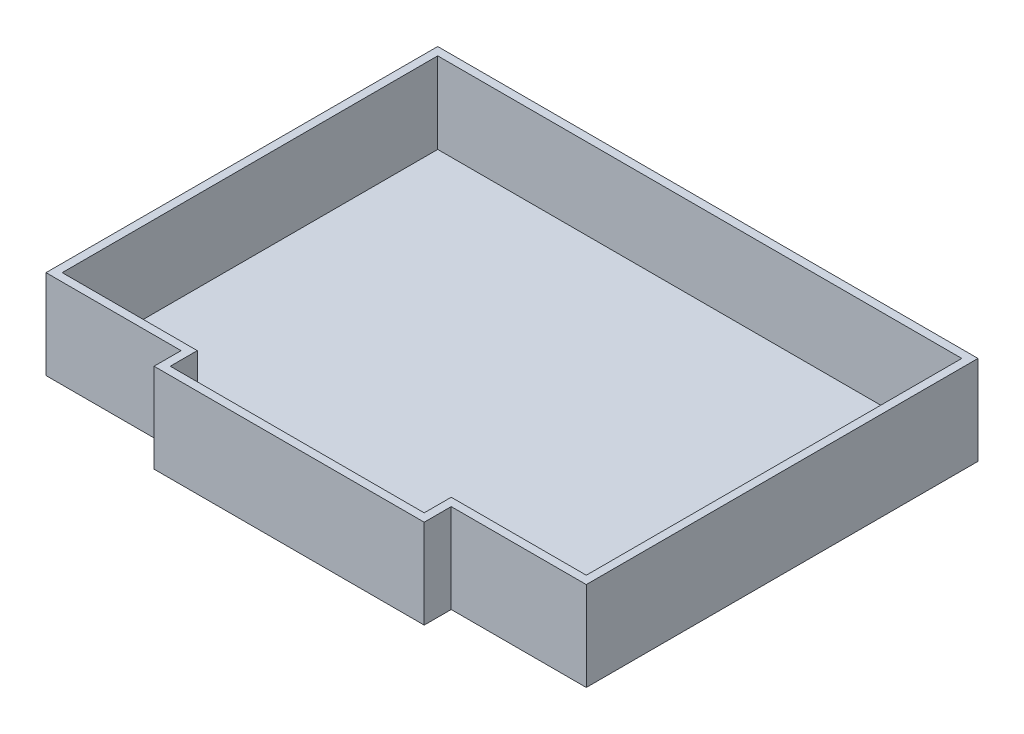
ISO-10303-21;
HEADER;
FILE_DESCRIPTION(('STEP AP214'),'2;1');
FILE_NAME('part.step','',(''),(''),'','','');
FILE_SCHEMA(('AUTOMOTIVE_DESIGN { 1 0 10303 214 1 1 1 1 }'));
ENDSEC;
DATA;
#1=APPLICATION_CONTEXT('core data for automotive mechanical design processes');
#2=APPLICATION_PROTOCOL_DEFINITION('international standard','automotive_design',2000,#1);
#3=PRODUCT_CONTEXT('',#1,'mechanical');
#4=PRODUCT('Part','Part','',(#3));
#5=PRODUCT_RELATED_PRODUCT_CATEGORY('part','',(#4));
#6=PRODUCT_DEFINITION_FORMATION('','',#4);
#7=PRODUCT_DEFINITION_CONTEXT('part definition',#1,'design');
#8=PRODUCT_DEFINITION('design','',#6,#7);
#9=PRODUCT_DEFINITION_SHAPE('','',#8);
#10=(LENGTH_UNIT() NAMED_UNIT(*) SI_UNIT(.MILLI.,.METRE.));
#11=(NAMED_UNIT(*) PLANE_ANGLE_UNIT() SI_UNIT($,.RADIAN.));
#12=(NAMED_UNIT(*) SI_UNIT($,.STERADIAN.) SOLID_ANGLE_UNIT());
#13=UNCERTAINTY_MEASURE_WITH_UNIT(LENGTH_MEASURE(1.E-05),#10,'distance_accuracy_value','');
#14=(GEOMETRIC_REPRESENTATION_CONTEXT(3) GLOBAL_UNCERTAINTY_ASSIGNED_CONTEXT((#13)) GLOBAL_UNIT_ASSIGNED_CONTEXT((#10,
#11,#12)) REPRESENTATION_CONTEXT('',''));
#15=CARTESIAN_POINT('',(0.,0.,0.));
#16=DIRECTION('',(0.,0.,1.));
#17=DIRECTION('',(1.,0.,0.));
#18=AXIS2_PLACEMENT_3D('',#15,#16,#17);
#19=CARTESIAN_POINT('',(200.,3.,-30.));
#20=DIRECTION('',(-1.,0.,0.));
#21=DIRECTION('',(0.,0.,1.));
#22=AXIS2_PLACEMENT_3D('',#19,#20,#21);
#23=PLANE('',#22);
#24=DIRECTION('',(0.,0.,-1.));
#25=VECTOR('',#24,1.);
#26=CARTESIAN_POINT('',(200.,0.,-30.));
#27=LINE('',#26,#25);
#28=CARTESIAN_POINT('',(200.,0.,-30.));
#29=VERTEX_POINT('',#28);
#30=CARTESIAN_POINT('',(200.,0.,-175.));
#31=VERTEX_POINT('',#30);
#32=EDGE_CURVE('E280',#29,#31,#27,.T.);
#33=ORIENTED_EDGE('',*,*,#32,.T.);
#34=DIRECTION('',(0.,-1.,0.));
#35=VECTOR('',#34,1.);
#36=CARTESIAN_POINT('',(200.,3.,-175.));
#37=LINE('',#36,#35);
#38=CARTESIAN_POINT('',(200.,33.,-175.));
#39=VERTEX_POINT('',#38);
#40=EDGE_CURVE('E11',#39,#31,#37,.T.);
#41=ORIENTED_EDGE('',*,*,#40,.F.);
#42=DIRECTION('',(0.,0.,-1.));
#43=VECTOR('',#42,1.);
#44=CARTESIAN_POINT('',(200.,33.,-175.));
#45=LINE('',#44,#43);
#46=CARTESIAN_POINT('',(200.,33.,-30.));
#47=VERTEX_POINT('',#46);
#48=EDGE_CURVE('E272',#47,#39,#45,.T.);
#49=ORIENTED_EDGE('',*,*,#48,.F.);
#50=DIRECTION('',(0.,-1.,0.));
#51=VECTOR('',#50,1.);
#52=CARTESIAN_POINT('',(200.,3.,-30.));
#53=LINE('',#52,#51);
#54=EDGE_CURVE('E304',#47,#29,#53,.T.);
#55=ORIENTED_EDGE('',*,*,#54,.T.);
#56=EDGE_LOOP('',(#33,#41,#49,#55));
#57=FACE_BOUND('',#56,.T.);
#58=ADVANCED_FACE('F41',(#57),#23,.F.);
#59=CARTESIAN_POINT('',(0.,3.,-175.));
#60=DIRECTION('',(0.,0.,1.));
#61=DIRECTION('',(1.,0.,0.));
#62=AXIS2_PLACEMENT_3D('',#59,#60,#61);
#63=PLANE('',#62);
#64=DIRECTION('',(-1.,0.,0.));
#65=VECTOR('',#64,1.);
#66=CARTESIAN_POINT('',(0.,0.,-175.));
#67=LINE('',#66,#65);
#68=CARTESIAN_POINT('',(0.,0.,-175.));
#69=VERTEX_POINT('',#68);
#70=EDGE_CURVE('E284',#31,#69,#67,.T.);
#71=ORIENTED_EDGE('',*,*,#70,.T.);
#72=DIRECTION('',(0.,-1.,0.));
#73=VECTOR('',#72,1.);
#74=CARTESIAN_POINT('',(0.,3.,-175.));
#75=LINE('',#74,#73);
#76=CARTESIAN_POINT('',(0.,33.,-175.));
#77=VERTEX_POINT('',#76);
#78=EDGE_CURVE('E49',#77,#69,#75,.T.);
#79=ORIENTED_EDGE('',*,*,#78,.F.);
#80=DIRECTION('',(-1.,0.,0.));
#81=VECTOR('',#80,1.);
#82=CARTESIAN_POINT('',(0.,33.,-175.));
#83=LINE('',#82,#81);
#84=EDGE_CURVE('E276',#39,#77,#83,.T.);
#85=ORIENTED_EDGE('',*,*,#84,.F.);
#86=ORIENTED_EDGE('',*,*,#40,.T.);
#87=EDGE_LOOP('',(#71,#79,#85,#86));
#88=FACE_BOUND('',#87,.T.);
#89=ADVANCED_FACE('F357',(#88),#63,.F.);
#90=CARTESIAN_POINT('',(0.,3.,-30.));
#91=DIRECTION('',(1.,0.,0.));
#92=DIRECTION('',(0.,0.,-1.));
#93=AXIS2_PLACEMENT_3D('',#90,#91,#92);
#94=PLANE('',#93);
#95=DIRECTION('',(0.,0.,1.));
#96=VECTOR('',#95,1.);
#97=CARTESIAN_POINT('',(0.,0.,-30.));
#98=LINE('',#97,#96);
#99=CARTESIAN_POINT('',(0.,0.,-30.));
#100=VERTEX_POINT('',#99);
#101=EDGE_CURVE('E287',#69,#100,#98,.T.);
#102=ORIENTED_EDGE('',*,*,#101,.T.);
#103=DIRECTION('',(0.,-1.,0.));
#104=VECTOR('',#103,1.);
#105=CARTESIAN_POINT('',(0.,3.,-30.));
#106=LINE('',#105,#104);
#107=CARTESIAN_POINT('',(0.,33.,-30.));
#108=VERTEX_POINT('',#107);
#109=EDGE_CURVE('E322',#108,#100,#106,.T.);
#110=ORIENTED_EDGE('',*,*,#109,.F.);
#111=DIRECTION('',(0.,0.,1.));
#112=VECTOR('',#111,1.);
#113=CARTESIAN_POINT('',(0.,33.,-30.));
#114=LINE('',#113,#112);
#115=EDGE_CURVE('E174',#77,#108,#114,.T.);
#116=ORIENTED_EDGE('',*,*,#115,.F.);
#117=ORIENTED_EDGE('',*,*,#78,.T.);
#118=EDGE_LOOP('',(#102,#110,#116,#117));
#119=FACE_BOUND('',#118,.T.);
#120=ADVANCED_FACE('F330',(#119),#94,.F.);
#121=CARTESIAN_POINT('',(0.,3.,-30.));
#122=DIRECTION('',(0.,0.,-1.));
#123=DIRECTION('',(-1.,0.,0.));
#124=AXIS2_PLACEMENT_3D('',#121,#122,#123);
#125=PLANE('',#124);
#126=DIRECTION('',(1.,0.,0.));
#127=VECTOR('',#126,1.);
#128=CARTESIAN_POINT('',(0.,0.,-30.));
#129=LINE('',#128,#127);
#130=CARTESIAN_POINT('',(50.,0.,-30.));
#131=VERTEX_POINT('',#130);
#132=EDGE_CURVE('E290',#100,#131,#129,.T.);
#133=ORIENTED_EDGE('',*,*,#132,.T.);
#134=DIRECTION('',(0.,-1.,0.));
#135=VECTOR('',#134,1.);
#136=CARTESIAN_POINT('',(50.,3.,-30.));
#137=LINE('',#136,#135);
#138=CARTESIAN_POINT('',(50.,33.,-30.));
#139=VERTEX_POINT('',#138);
#140=EDGE_CURVE('E318',#139,#131,#137,.T.);
#141=ORIENTED_EDGE('',*,*,#140,.F.);
#142=DIRECTION('',(1.,0.,0.));
#143=VECTOR('',#142,1.);
#144=CARTESIAN_POINT('',(50.,33.,-30.));
#145=LINE('',#144,#143);
#146=EDGE_CURVE('E252',#108,#139,#145,.T.);
#147=ORIENTED_EDGE('',*,*,#146,.F.);
#148=ORIENTED_EDGE('',*,*,#109,.T.);
#149=EDGE_LOOP('',(#133,#141,#147,#148));
#150=FACE_BOUND('',#149,.T.);
#151=ADVANCED_FACE('F340',(#150),#125,.F.);
#152=CARTESIAN_POINT('',(50.,3.,-20.));
#153=DIRECTION('',(1.,0.,0.));
#154=DIRECTION('',(0.,0.,-1.));
#155=AXIS2_PLACEMENT_3D('',#152,#153,#154);
#156=PLANE('',#155);
#157=DIRECTION('',(0.,0.,1.));
#158=VECTOR('',#157,1.);
#159=CARTESIAN_POINT('',(50.,0.,-20.));
#160=LINE('',#159,#158);
#161=CARTESIAN_POINT('',(50.,0.,-20.));
#162=VERTEX_POINT('',#161);
#163=EDGE_CURVE('E293',#131,#162,#160,.T.);
#164=ORIENTED_EDGE('',*,*,#163,.T.);
#165=DIRECTION('',(0.,-1.,0.));
#166=VECTOR('',#165,1.);
#167=CARTESIAN_POINT('',(50.,3.,-20.));
#168=LINE('',#167,#166);
#169=CARTESIAN_POINT('',(50.,33.,-20.));
#170=VERTEX_POINT('',#169);
#171=EDGE_CURVE('E314',#170,#162,#168,.T.);
#172=ORIENTED_EDGE('',*,*,#171,.F.);
#173=DIRECTION('',(0.,0.,1.));
#174=VECTOR('',#173,1.);
#175=CARTESIAN_POINT('',(50.,33.,-20.));
#176=LINE('',#175,#174);
#177=EDGE_CURVE('E256',#139,#170,#176,.T.);
#178=ORIENTED_EDGE('',*,*,#177,.F.);
#179=ORIENTED_EDGE('',*,*,#140,.T.);
#180=EDGE_LOOP('',(#164,#172,#178,#179));
#181=FACE_BOUND('',#180,.T.);
#182=ADVANCED_FACE('F344',(#181),#156,.F.);
#183=CARTESIAN_POINT('',(50.,3.,-20.));
#184=DIRECTION('',(0.,0.,-1.));
#185=DIRECTION('',(-1.,0.,0.));
#186=AXIS2_PLACEMENT_3D('',#183,#184,#185);
#187=PLANE('',#186);
#188=DIRECTION('',(1.,0.,0.));
#189=VECTOR('',#188,1.);
#190=CARTESIAN_POINT('',(50.,0.,-20.));
#191=LINE('',#190,#189);
#192=CARTESIAN_POINT('',(150.,0.,-20.));
#193=VERTEX_POINT('',#192);
#194=EDGE_CURVE('E296',#162,#193,#191,.T.);
#195=ORIENTED_EDGE('',*,*,#194,.T.);
#196=DIRECTION('',(0.,-1.,0.));
#197=VECTOR('',#196,1.);
#198=CARTESIAN_POINT('',(150.,3.,-20.));
#199=LINE('',#198,#197);
#200=CARTESIAN_POINT('',(150.,33.,-20.));
#201=VERTEX_POINT('',#200);
#202=EDGE_CURVE('E310',#201,#193,#199,.T.);
#203=ORIENTED_EDGE('',*,*,#202,.F.);
#204=DIRECTION('',(1.,0.,0.));
#205=VECTOR('',#204,1.);
#206=CARTESIAN_POINT('',(150.,33.,-20.));
#207=LINE('',#206,#205);
#208=EDGE_CURVE('E260',#170,#201,#207,.T.);
#209=ORIENTED_EDGE('',*,*,#208,.F.);
#210=ORIENTED_EDGE('',*,*,#171,.T.);
#211=EDGE_LOOP('',(#195,#203,#209,#210));
#212=FACE_BOUND('',#211,.T.);
#213=ADVANCED_FACE('F349',(#212),#187,.F.);
#214=CARTESIAN_POINT('',(150.,3.,-20.));
#215=DIRECTION('',(-1.,0.,0.));
#216=DIRECTION('',(0.,0.,1.));
#217=AXIS2_PLACEMENT_3D('',#214,#215,#216);
#218=PLANE('',#217);
#219=DIRECTION('',(0.,0.,-1.));
#220=VECTOR('',#219,1.);
#221=CARTESIAN_POINT('',(150.,0.,-20.));
#222=LINE('',#221,#220);
#223=CARTESIAN_POINT('',(150.,0.,-30.));
#224=VERTEX_POINT('',#223);
#225=EDGE_CURVE('E299',#193,#224,#222,.T.);
#226=ORIENTED_EDGE('',*,*,#225,.T.);
#227=DIRECTION('',(0.,-1.,0.));
#228=VECTOR('',#227,1.);
#229=CARTESIAN_POINT('',(150.,3.,-30.));
#230=LINE('',#229,#228);
#231=CARTESIAN_POINT('',(150.,33.,-30.));
#232=VERTEX_POINT('',#231);
#233=EDGE_CURVE('E307',#232,#224,#230,.T.);
#234=ORIENTED_EDGE('',*,*,#233,.F.);
#235=DIRECTION('',(0.,0.,-1.));
#236=VECTOR('',#235,1.);
#237=CARTESIAN_POINT('',(150.,33.,-30.));
#238=LINE('',#237,#236);
#239=EDGE_CURVE('E264',#201,#232,#238,.T.);
#240=ORIENTED_EDGE('',*,*,#239,.F.);
#241=ORIENTED_EDGE('',*,*,#202,.T.);
#242=EDGE_LOOP('',(#226,#234,#240,#241));
#243=FACE_BOUND('',#242,.T.);
#244=ADVANCED_FACE('F352',(#243),#218,.F.);
#245=CARTESIAN_POINT('',(200.,3.,-30.));
#246=DIRECTION('',(0.,0.,-1.));
#247=DIRECTION('',(-1.,0.,0.));
#248=AXIS2_PLACEMENT_3D('',#245,#246,#247);
#249=PLANE('',#248);
#250=DIRECTION('',(1.,0.,0.));
#251=VECTOR('',#250,1.);
#252=CARTESIAN_POINT('',(200.,0.,-30.));
#253=LINE('',#252,#251);
#254=EDGE_CURVE('E64',#224,#29,#253,.T.);
#255=ORIENTED_EDGE('',*,*,#254,.T.);
#256=ORIENTED_EDGE('',*,*,#54,.F.);
#257=DIRECTION('',(1.,0.,0.));
#258=VECTOR('',#257,1.);
#259=CARTESIAN_POINT('',(200.,33.,-30.));
#260=LINE('',#259,#258);
#261=EDGE_CURVE('E268',#232,#47,#260,.T.);
#262=ORIENTED_EDGE('',*,*,#261,.F.);
#263=ORIENTED_EDGE('',*,*,#233,.T.);
#264=EDGE_LOOP('',(#255,#256,#262,#263));
#265=FACE_BOUND('',#264,.T.);
#266=ADVANCED_FACE('F356',(#265),#249,.F.);
#267=CARTESIAN_POINT('',(0.,0.,0.));
#268=DIRECTION('',(0.,-1.,0.));
#269=DIRECTION('',(0.,0.,-1.));
#270=AXIS2_PLACEMENT_3D('',#267,#268,#269);
#271=PLANE('',#270);
#272=ORIENTED_EDGE('',*,*,#32,.F.);
#273=ORIENTED_EDGE('',*,*,#254,.F.);
#274=ORIENTED_EDGE('',*,*,#225,.F.);
#275=ORIENTED_EDGE('',*,*,#194,.F.);
#276=ORIENTED_EDGE('',*,*,#163,.F.);
#277=ORIENTED_EDGE('',*,*,#132,.F.);
#278=ORIENTED_EDGE('',*,*,#101,.F.);
#279=ORIENTED_EDGE('',*,*,#70,.F.);
#280=EDGE_LOOP('',(#272,#273,#274,#275,#276,#277,#278,#279));
#281=FACE_BOUND('',#280,.T.);
#282=ADVANCED_FACE('F336',(#281),#271,.T.);
#283=CARTESIAN_POINT('',(0.,33.,0.));
#284=DIRECTION('',(0.,-1.,0.));
#285=DIRECTION('',(0.,0.,-1.));
#286=AXIS2_PLACEMENT_3D('',#283,#284,#285);
#287=PLANE('',#286);
#288=ORIENTED_EDGE('',*,*,#115,.T.);
#289=ORIENTED_EDGE('',*,*,#146,.T.);
#290=ORIENTED_EDGE('',*,*,#177,.T.);
#291=ORIENTED_EDGE('',*,*,#208,.T.);
#292=ORIENTED_EDGE('',*,*,#239,.T.);
#293=ORIENTED_EDGE('',*,*,#261,.T.);
#294=ORIENTED_EDGE('',*,*,#48,.T.);
#295=ORIENTED_EDGE('',*,*,#84,.T.);
#296=EDGE_LOOP('',(#288,#289,#290,#291,#292,#293,#294,#295));
#297=FACE_BOUND('',#296,.T.);
#298=DIRECTION('',(1.,0.,0.));
#299=VECTOR('',#298,1.);
#300=CARTESIAN_POINT('',(147.,33.,-33.));
#301=LINE('',#300,#299);
#302=CARTESIAN_POINT('',(147.,33.,-33.));
#303=VERTEX_POINT('',#302);
#304=CARTESIAN_POINT('',(197.,33.,-33.));
#305=VERTEX_POINT('',#304);
#306=EDGE_CURVE('E156',#303,#305,#301,.T.);
#307=ORIENTED_EDGE('',*,*,#306,.F.);
#308=DIRECTION('',(0.,0.,-1.));
#309=VECTOR('',#308,1.);
#310=CARTESIAN_POINT('',(147.,33.,-23.));
#311=LINE('',#310,#309);
#312=CARTESIAN_POINT('',(147.,33.,-23.));
#313=VERTEX_POINT('',#312);
#314=EDGE_CURVE('E199',#313,#303,#311,.T.);
#315=ORIENTED_EDGE('',*,*,#314,.F.);
#316=DIRECTION('',(1.,0.,0.));
#317=VECTOR('',#316,1.);
#318=CARTESIAN_POINT('',(53.,33.,-23.));
#319=LINE('',#318,#317);
#320=CARTESIAN_POINT('',(53.,33.,-23.));
#321=VERTEX_POINT('',#320);
#322=EDGE_CURVE('E195',#321,#313,#319,.T.);
#323=ORIENTED_EDGE('',*,*,#322,.F.);
#324=DIRECTION('',(0.,0.,1.));
#325=VECTOR('',#324,1.);
#326=CARTESIAN_POINT('',(53.,33.,-33.));
#327=LINE('',#326,#325);
#328=CARTESIAN_POINT('',(53.,33.,-33.));
#329=VERTEX_POINT('',#328);
#330=EDGE_CURVE('E192',#329,#321,#327,.T.);
#331=ORIENTED_EDGE('',*,*,#330,.F.);
#332=DIRECTION('',(1.,0.,0.));
#333=VECTOR('',#332,1.);
#334=CARTESIAN_POINT('',(2.99999999999999,33.,-33.));
#335=LINE('',#334,#333);
#336=CARTESIAN_POINT('',(2.99999999999999,33.,-33.));
#337=VERTEX_POINT('',#336);
#338=EDGE_CURVE('E189',#337,#329,#335,.T.);
#339=ORIENTED_EDGE('',*,*,#338,.F.);
#340=DIRECTION('',(0.,0.,1.));
#341=VECTOR('',#340,1.);
#342=CARTESIAN_POINT('',(3.,33.,-172.));
#343=LINE('',#342,#341);
#344=CARTESIAN_POINT('',(3.,33.,-172.));
#345=VERTEX_POINT('',#344);
#346=EDGE_CURVE('E184',#345,#337,#343,.T.);
#347=ORIENTED_EDGE('',*,*,#346,.F.);
#348=DIRECTION('',(-1.,0.,0.));
#349=VECTOR('',#348,1.);
#350=CARTESIAN_POINT('',(197.,33.,-172.));
#351=LINE('',#350,#349);
#352=CARTESIAN_POINT('',(197.,33.,-172.));
#353=VERTEX_POINT('',#352);
#354=EDGE_CURVE('E180',#353,#345,#351,.T.);
#355=ORIENTED_EDGE('',*,*,#354,.F.);
#356=DIRECTION('',(0.,0.,-1.));
#357=VECTOR('',#356,1.);
#358=CARTESIAN_POINT('',(197.,33.,-33.));
#359=LINE('',#358,#357);
#360=EDGE_CURVE('E165',#305,#353,#359,.T.);
#361=ORIENTED_EDGE('',*,*,#360,.F.);
#362=EDGE_LOOP('',(#307,#315,#323,#331,#339,#347,#355,#361));
#363=FACE_BOUND('',#362,.T.);
#364=ADVANCED_FACE('F178',(#297,#363),#287,.F.);
#365=CARTESIAN_POINT('',(147.,33.,-33.));
#366=DIRECTION('',(0.,0.,-1.));
#367=DIRECTION('',(-1.,0.,0.));
#368=AXIS2_PLACEMENT_3D('',#365,#366,#367);
#369=PLANE('',#368);
#370=DIRECTION('',(1.,0.,0.));
#371=VECTOR('',#370,1.);
#372=CARTESIAN_POINT('',(147.,3.,-33.));
#373=LINE('',#372,#371);
#374=CARTESIAN_POINT('',(147.,3.,-33.));
#375=VERTEX_POINT('',#374);
#376=CARTESIAN_POINT('',(197.,3.,-33.));
#377=VERTEX_POINT('',#376);
#378=EDGE_CURVE('E202',#375,#377,#373,.T.);
#379=ORIENTED_EDGE('',*,*,#378,.F.);
#380=DIRECTION('',(0.,-1.,0.));
#381=VECTOR('',#380,1.);
#382=CARTESIAN_POINT('',(147.,33.,-33.));
#383=LINE('',#382,#381);
#384=EDGE_CURVE('E56',#303,#375,#383,.T.);
#385=ORIENTED_EDGE('',*,*,#384,.F.);
#386=ORIENTED_EDGE('',*,*,#306,.T.);
#387=DIRECTION('',(0.,-1.,0.));
#388=VECTOR('',#387,1.);
#389=CARTESIAN_POINT('',(197.,33.,-33.));
#390=LINE('',#389,#388);
#391=EDGE_CURVE('E159',#305,#377,#390,.T.);
#392=ORIENTED_EDGE('',*,*,#391,.T.);
#393=EDGE_LOOP('',(#379,#385,#386,#392));
#394=FACE_BOUND('',#393,.T.);
#395=ADVANCED_FACE('F158',(#394),#369,.T.);
#396=CARTESIAN_POINT('',(197.,33.,-33.));
#397=DIRECTION('',(-1.,0.,0.));
#398=DIRECTION('',(0.,0.,1.));
#399=AXIS2_PLACEMENT_3D('',#396,#397,#398);
#400=PLANE('',#399);
#401=DIRECTION('',(0.,0.,-1.));
#402=VECTOR('',#401,1.);
#403=CARTESIAN_POINT('',(197.,3.,-33.));
#404=LINE('',#403,#402);
#405=CARTESIAN_POINT('',(197.,3.,-172.));
#406=VERTEX_POINT('',#405);
#407=EDGE_CURVE('E172',#377,#406,#404,.T.);
#408=ORIENTED_EDGE('',*,*,#407,.F.);
#409=ORIENTED_EDGE('',*,*,#391,.F.);
#410=ORIENTED_EDGE('',*,*,#360,.T.);
#411=DIRECTION('',(0.,-1.,0.));
#412=VECTOR('',#411,1.);
#413=CARTESIAN_POINT('',(197.,33.,-172.));
#414=LINE('',#413,#412);
#415=EDGE_CURVE('E175',#353,#406,#414,.T.);
#416=ORIENTED_EDGE('',*,*,#415,.T.);
#417=EDGE_LOOP('',(#408,#409,#410,#416));
#418=FACE_BOUND('',#417,.T.);
#419=ADVANCED_FACE('F169',(#418),#400,.T.);
#420=CARTESIAN_POINT('',(197.,33.,-172.));
#421=DIRECTION('',(0.,0.,1.));
#422=DIRECTION('',(1.,0.,0.));
#423=AXIS2_PLACEMENT_3D('',#420,#421,#422);
#424=PLANE('',#423);
#425=DIRECTION('',(-1.,0.,0.));
#426=VECTOR('',#425,1.);
#427=CARTESIAN_POINT('',(197.,3.,-172.));
#428=LINE('',#427,#426);
#429=CARTESIAN_POINT('',(3.,3.,-172.));
#430=VERTEX_POINT('',#429);
#431=EDGE_CURVE('E207',#406,#430,#428,.T.);
#432=ORIENTED_EDGE('',*,*,#431,.F.);
#433=ORIENTED_EDGE('',*,*,#415,.F.);
#434=ORIENTED_EDGE('',*,*,#354,.T.);
#435=DIRECTION('',(0.,-1.,0.));
#436=VECTOR('',#435,1.);
#437=CARTESIAN_POINT('',(3.,33.,-172.));
#438=LINE('',#437,#436);
#439=EDGE_CURVE('E244',#345,#430,#438,.T.);
#440=ORIENTED_EDGE('',*,*,#439,.T.);
#441=EDGE_LOOP('',(#432,#433,#434,#440));
#442=FACE_BOUND('',#441,.T.);
#443=ADVANCED_FACE('F388',(#442),#424,.T.);
#444=CARTESIAN_POINT('',(3.,33.,-172.));
#445=DIRECTION('',(1.,0.,0.));
#446=DIRECTION('',(0.,0.,-1.));
#447=AXIS2_PLACEMENT_3D('',#444,#445,#446);
#448=PLANE('',#447);
#449=DIRECTION('',(0.,0.,1.));
#450=VECTOR('',#449,1.);
#451=CARTESIAN_POINT('',(3.,3.,-172.));
#452=LINE('',#451,#450);
#453=CARTESIAN_POINT('',(2.99999999999999,3.,-33.));
#454=VERTEX_POINT('',#453);
#455=EDGE_CURVE('E211',#430,#454,#452,.T.);
#456=ORIENTED_EDGE('',*,*,#455,.F.);
#457=ORIENTED_EDGE('',*,*,#439,.F.);
#458=ORIENTED_EDGE('',*,*,#346,.T.);
#459=DIRECTION('',(0.,-1.,0.));
#460=VECTOR('',#459,1.);
#461=CARTESIAN_POINT('',(2.99999999999999,33.,-33.));
#462=LINE('',#461,#460);
#463=EDGE_CURVE('E241',#337,#454,#462,.T.);
#464=ORIENTED_EDGE('',*,*,#463,.T.);
#465=EDGE_LOOP('',(#456,#457,#458,#464));
#466=FACE_BOUND('',#465,.T.);
#467=ADVANCED_FACE('F391',(#466),#448,.T.);
#468=CARTESIAN_POINT('',(2.99999999999999,33.,-33.));
#469=DIRECTION('',(0.,0.,-1.));
#470=DIRECTION('',(-1.,0.,0.));
#471=AXIS2_PLACEMENT_3D('',#468,#469,#470);
#472=PLANE('',#471);
#473=DIRECTION('',(1.,0.,0.));
#474=VECTOR('',#473,1.);
#475=CARTESIAN_POINT('',(2.99999999999999,3.,-33.));
#476=LINE('',#475,#474);
#477=CARTESIAN_POINT('',(53.,3.,-33.));
#478=VERTEX_POINT('',#477);
#479=EDGE_CURVE('E215',#454,#478,#476,.T.);
#480=ORIENTED_EDGE('',*,*,#479,.F.);
#481=ORIENTED_EDGE('',*,*,#463,.F.);
#482=ORIENTED_EDGE('',*,*,#338,.T.);
#483=DIRECTION('',(0.,-1.,0.));
#484=VECTOR('',#483,1.);
#485=CARTESIAN_POINT('',(53.,33.,-33.));
#486=LINE('',#485,#484);
#487=EDGE_CURVE('E238',#329,#478,#486,.T.);
#488=ORIENTED_EDGE('',*,*,#487,.T.);
#489=EDGE_LOOP('',(#480,#481,#482,#488));
#490=FACE_BOUND('',#489,.T.);
#491=ADVANCED_FACE('F395',(#490),#472,.T.);
#492=CARTESIAN_POINT('',(53.,33.,-33.));
#493=DIRECTION('',(1.,0.,0.));
#494=DIRECTION('',(0.,0.,-1.));
#495=AXIS2_PLACEMENT_3D('',#492,#493,#494);
#496=PLANE('',#495);
#497=DIRECTION('',(0.,0.,1.));
#498=VECTOR('',#497,1.);
#499=CARTESIAN_POINT('',(53.,3.,-33.));
#500=LINE('',#499,#498);
#501=CARTESIAN_POINT('',(53.,3.,-23.));
#502=VERTEX_POINT('',#501);
#503=EDGE_CURVE('E219',#478,#502,#500,.T.);
#504=ORIENTED_EDGE('',*,*,#503,.F.);
#505=ORIENTED_EDGE('',*,*,#487,.F.);
#506=ORIENTED_EDGE('',*,*,#330,.T.);
#507=DIRECTION('',(0.,-1.,0.));
#508=VECTOR('',#507,1.);
#509=CARTESIAN_POINT('',(53.,33.,-23.));
#510=LINE('',#509,#508);
#511=EDGE_CURVE('E235',#321,#502,#510,.T.);
#512=ORIENTED_EDGE('',*,*,#511,.T.);
#513=EDGE_LOOP('',(#504,#505,#506,#512));
#514=FACE_BOUND('',#513,.T.);
#515=ADVANCED_FACE('F399',(#514),#496,.T.);
#516=CARTESIAN_POINT('',(53.,33.,-23.));
#517=DIRECTION('',(0.,0.,-1.));
#518=DIRECTION('',(-1.,0.,0.));
#519=AXIS2_PLACEMENT_3D('',#516,#517,#518);
#520=PLANE('',#519);
#521=DIRECTION('',(1.,0.,0.));
#522=VECTOR('',#521,1.);
#523=CARTESIAN_POINT('',(53.,3.,-23.));
#524=LINE('',#523,#522);
#525=CARTESIAN_POINT('',(147.,3.,-23.));
#526=VERTEX_POINT('',#525);
#527=EDGE_CURVE('E223',#502,#526,#524,.T.);
#528=ORIENTED_EDGE('',*,*,#527,.F.);
#529=ORIENTED_EDGE('',*,*,#511,.F.);
#530=ORIENTED_EDGE('',*,*,#322,.T.);
#531=DIRECTION('',(0.,-1.,0.));
#532=VECTOR('',#531,1.);
#533=CARTESIAN_POINT('',(147.,33.,-23.));
#534=LINE('',#533,#532);
#535=EDGE_CURVE('E232',#313,#526,#534,.T.);
#536=ORIENTED_EDGE('',*,*,#535,.T.);
#537=EDGE_LOOP('',(#528,#529,#530,#536));
#538=FACE_BOUND('',#537,.T.);
#539=ADVANCED_FACE('F403',(#538),#520,.T.);
#540=CARTESIAN_POINT('',(147.,33.,-23.));
#541=DIRECTION('',(-1.,0.,0.));
#542=DIRECTION('',(0.,0.,1.));
#543=AXIS2_PLACEMENT_3D('',#540,#541,#542);
#544=PLANE('',#543);
#545=DIRECTION('',(0.,0.,-1.));
#546=VECTOR('',#545,1.);
#547=CARTESIAN_POINT('',(147.,3.,-23.));
#548=LINE('',#547,#546);
#549=EDGE_CURVE('E166',#526,#375,#548,.T.);
#550=ORIENTED_EDGE('',*,*,#549,.F.);
#551=ORIENTED_EDGE('',*,*,#535,.F.);
#552=ORIENTED_EDGE('',*,*,#314,.T.);
#553=ORIENTED_EDGE('',*,*,#384,.T.);
#554=EDGE_LOOP('',(#550,#551,#552,#553));
#555=FACE_BOUND('',#554,.T.);
#556=ADVANCED_FACE('F380',(#555),#544,.T.);
#557=CARTESIAN_POINT('',(0.,3.,0.));
#558=DIRECTION('',(0.,-1.,0.));
#559=DIRECTION('',(0.,0.,-1.));
#560=AXIS2_PLACEMENT_3D('',#557,#558,#559);
#561=PLANE('',#560);
#562=ORIENTED_EDGE('',*,*,#549,.T.);
#563=ORIENTED_EDGE('',*,*,#378,.T.);
#564=ORIENTED_EDGE('',*,*,#407,.T.);
#565=ORIENTED_EDGE('',*,*,#431,.T.);
#566=ORIENTED_EDGE('',*,*,#455,.T.);
#567=ORIENTED_EDGE('',*,*,#479,.T.);
#568=ORIENTED_EDGE('',*,*,#503,.T.);
#569=ORIENTED_EDGE('',*,*,#527,.T.);
#570=EDGE_LOOP('',(#562,#563,#564,#565,#566,#567,#568,#569));
#571=FACE_BOUND('',#570,.T.);
#572=ADVANCED_FACE('F377',(#571),#561,.F.);
#573=CLOSED_SHELL('',(#58,#89,#120,#151,#182,#213,#244,#266,#282,#364,#395,#419,#443,#467,#491,
#515,#539,#556,#572));
#574=MANIFOLD_SOLID_BREP('B2',#573);
#575=ADVANCED_BREP_SHAPE_REPRESENTATION('',(#18,#574),#14);
#576=SHAPE_DEFINITION_REPRESENTATION(#9,#575);
ENDSEC;
END-ISO-10303-21;
